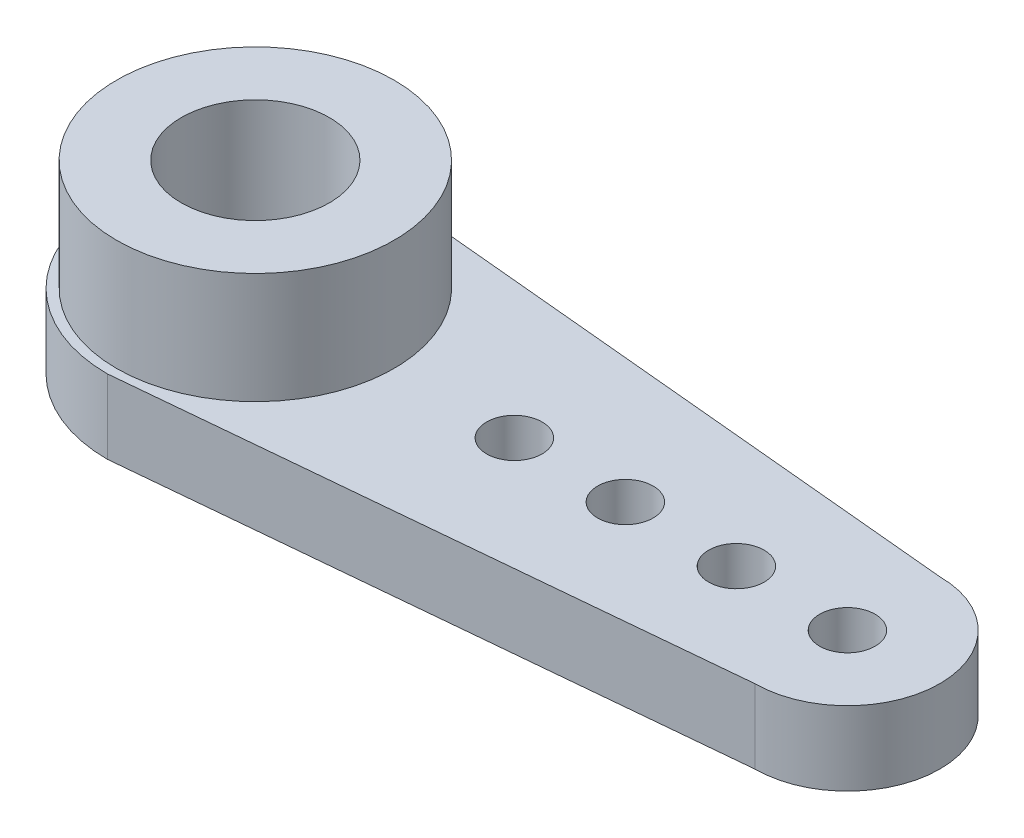
ISO-10303-21;
HEADER;
FILE_DESCRIPTION(('STEP AP214'),'2;1');
FILE_NAME('part.step','',(''),(''),'','','');
FILE_SCHEMA(('AUTOMOTIVE_DESIGN { 1 0 10303 214 1 1 1 1 }'));
ENDSEC;
DATA;
#1=APPLICATION_CONTEXT('core data for automotive mechanical design processes');
#2=APPLICATION_PROTOCOL_DEFINITION('international standard','automotive_design',2000,#1);
#3=PRODUCT_CONTEXT('',#1,'mechanical');
#4=PRODUCT('Part','Part','',(#3));
#5=PRODUCT_RELATED_PRODUCT_CATEGORY('part','',(#4));
#6=PRODUCT_DEFINITION_FORMATION('','',#4);
#7=PRODUCT_DEFINITION_CONTEXT('part definition',#1,'design');
#8=PRODUCT_DEFINITION('design','',#6,#7);
#9=PRODUCT_DEFINITION_SHAPE('','',#8);
#10=(LENGTH_UNIT() NAMED_UNIT(*) SI_UNIT(.MILLI.,.METRE.));
#11=(NAMED_UNIT(*) PLANE_ANGLE_UNIT() SI_UNIT($,.RADIAN.));
#12=(NAMED_UNIT(*) SI_UNIT($,.STERADIAN.) SOLID_ANGLE_UNIT());
#13=UNCERTAINTY_MEASURE_WITH_UNIT(LENGTH_MEASURE(1.E-05),#10,'distance_accuracy_value','');
#14=(GEOMETRIC_REPRESENTATION_CONTEXT(3) GLOBAL_UNCERTAINTY_ASSIGNED_CONTEXT((#13)) GLOBAL_UNIT_ASSIGNED_CONTEXT((#10,
#11,#12)) REPRESENTATION_CONTEXT('',''));
#15=CARTESIAN_POINT('',(0.,0.,0.));
#16=DIRECTION('',(0.,0.,1.));
#17=DIRECTION('',(1.,0.,0.));
#18=AXIS2_PLACEMENT_3D('',#15,#16,#17);
#19=CARTESIAN_POINT('',(0.,2.,0.));
#20=DIRECTION('',(0.,1.,0.));
#21=DIRECTION('',(0.,0.,1.));
#22=AXIS2_PLACEMENT_3D('',#19,#20,#21);
#23=PLANE('',#22);
#24=CARTESIAN_POINT('',(7.,2.,0.));
#25=DIRECTION('',(0.,1.,0.));
#26=DIRECTION('',(0.,0.,1.));
#27=AXIS2_PLACEMENT_3D('',#24,#25,#26);
#28=CIRCLE('',#27,0.749999999999999);
#29=CARTESIAN_POINT('',(7.,2.,0.749999999999999));
#30=VERTEX_POINT('',#29);
#31=EDGE_CURVE('E140',#30,#30,#28,.T.);
#32=ORIENTED_EDGE('',*,*,#31,.F.);
#33=EDGE_LOOP('',(#32));
#34=FACE_BOUND('',#33,.T.);
#35=CARTESIAN_POINT('',(13.,2.,0.));
#36=DIRECTION('',(0.,1.,0.));
#37=DIRECTION('',(0.,0.,1.));
#38=AXIS2_PLACEMENT_3D('',#35,#36,#37);
#39=CIRCLE('',#38,0.75);
#40=CARTESIAN_POINT('',(13.,2.,0.75));
#41=VERTEX_POINT('',#40);
#42=EDGE_CURVE('E150',#41,#41,#39,.T.);
#43=ORIENTED_EDGE('',*,*,#42,.F.);
#44=EDGE_LOOP('',(#43));
#45=FACE_BOUND('',#44,.T.);
#46=CARTESIAN_POINT('',(0.,2.,0.));
#47=DIRECTION('',(0.,1.,0.));
#48=DIRECTION('',(0.,0.,1.));
#49=AXIS2_PLACEMENT_3D('',#46,#47,#48);
#50=CIRCLE('',#49,4.);
#51=CARTESIAN_POINT('',(0.,2.,-4.));
#52=VERTEX_POINT('',#51);
#53=CARTESIAN_POINT('',(0.,2.,4.));
#54=VERTEX_POINT('',#53);
#55=EDGE_CURVE('E86',#52,#54,#50,.T.);
#56=ORIENTED_EDGE('',*,*,#55,.T.);
#57=DIRECTION('',(0.995634226059288,0.,-0.0933407086930583));
#58=VECTOR('',#57,1.);
#59=CARTESIAN_POINT('',(0.,2.,4.));
#60=LINE('',#59,#58);
#61=CARTESIAN_POINT('',(16.,2.,2.5));
#62=VERTEX_POINT('',#61);
#63=EDGE_CURVE('E81',#54,#62,#60,.T.);
#64=ORIENTED_EDGE('',*,*,#63,.T.);
#65=CARTESIAN_POINT('',(16.,2.,0.));
#66=DIRECTION('',(0.,1.,0.));
#67=DIRECTION('',(0.,0.,1.));
#68=AXIS2_PLACEMENT_3D('',#65,#66,#67);
#69=CIRCLE('',#68,2.5);
#70=CARTESIAN_POINT('',(16.,2.,-2.5));
#71=VERTEX_POINT('',#70);
#72=EDGE_CURVE('E84',#62,#71,#69,.T.);
#73=ORIENTED_EDGE('',*,*,#72,.T.);
#74=DIRECTION('',(-0.995634226059288,0.,-0.0933407086930583));
#75=VECTOR('',#74,1.);
#76=CARTESIAN_POINT('',(0.,2.,-4.));
#77=LINE('',#76,#75);
#78=EDGE_CURVE('E50',#71,#52,#77,.T.);
#79=ORIENTED_EDGE('',*,*,#78,.T.);
#80=EDGE_LOOP('',(#56,#64,#73,#79));
#81=FACE_BOUND('',#80,.T.);
#82=CARTESIAN_POINT('',(16.,2.,0.));
#83=DIRECTION('',(0.,1.,0.));
#84=DIRECTION('',(0.,0.,1.));
#85=AXIS2_PLACEMENT_3D('',#82,#83,#84);
#86=CIRCLE('',#85,0.750000000000002);
#87=CARTESIAN_POINT('',(16.,2.,0.750000000000002));
#88=VERTEX_POINT('',#87);
#89=EDGE_CURVE('E103',#88,#88,#86,.T.);
#90=ORIENTED_EDGE('',*,*,#89,.F.);
#91=EDGE_LOOP('',(#90));
#92=FACE_BOUND('',#91,.T.);
#93=CARTESIAN_POINT('',(10.,2.,0.));
#94=DIRECTION('',(0.,1.,0.));
#95=DIRECTION('',(0.,0.,1.));
#96=AXIS2_PLACEMENT_3D('',#93,#94,#95);
#97=CIRCLE('',#96,0.75);
#98=CARTESIAN_POINT('',(10.,2.,0.75));
#99=VERTEX_POINT('',#98);
#100=EDGE_CURVE('E145',#99,#99,#97,.T.);
#101=ORIENTED_EDGE('',*,*,#100,.F.);
#102=EDGE_LOOP('',(#101));
#103=FACE_BOUND('',#102,.T.);
#104=CARTESIAN_POINT('',(0.,2.,0.));
#105=DIRECTION('',(0.,1.,0.));
#106=DIRECTION('',(0.,0.,1.));
#107=AXIS2_PLACEMENT_3D('',#104,#105,#106);
#108=CIRCLE('',#107,3.75);
#109=CARTESIAN_POINT('',(0.,2.,3.75));
#110=VERTEX_POINT('',#109);
#111=EDGE_CURVE('E136',#110,#110,#108,.T.);
#112=ORIENTED_EDGE('',*,*,#111,.F.);
#113=EDGE_LOOP('',(#112));
#114=FACE_BOUND('',#113,.T.);
#115=ADVANCED_FACE('F33',(#34,#45,#81,#92,#103,#114),#23,.T.);
#116=CARTESIAN_POINT('',(0.,2.,0.));
#117=DIRECTION('',(0.,1.,0.));
#118=DIRECTION('',(0.,0.,1.));
#119=AXIS2_PLACEMENT_3D('',#116,#117,#118);
#120=CIRCLE('',#119,2.);
#121=CARTESIAN_POINT('',(0.,2.,2.));
#122=VERTEX_POINT('',#121);
#123=EDGE_CURVE('E11',#122,#122,#120,.F.);
#124=ORIENTED_EDGE('',*,*,#123,.F.);
#125=EDGE_LOOP('',(#124));
#126=FACE_BOUND('',#125,.T.);
#127=CARTESIAN_POINT('',(0.,2.,0.));
#128=DIRECTION('',(0.,1.,0.));
#129=DIRECTION('',(0.,0.,1.));
#130=AXIS2_PLACEMENT_3D('',#127,#128,#129);
#131=CIRCLE('',#130,1.);
#132=CARTESIAN_POINT('',(0.,2.,1.));
#133=VERTEX_POINT('',#132);
#134=EDGE_CURVE('E129',#133,#133,#131,.T.);
#135=ORIENTED_EDGE('',*,*,#134,.F.);
#136=EDGE_LOOP('',(#135));
#137=FACE_BOUND('',#136,.T.);
#138=ADVANCED_FACE('F114',(#126,#137),#23,.T.);
#139=CARTESIAN_POINT('',(0.,0.,0.));
#140=DIRECTION('',(0.,1.,0.));
#141=DIRECTION('',(0.,0.,1.));
#142=AXIS2_PLACEMENT_3D('',#139,#140,#141);
#143=PLANE('',#142);
#144=CARTESIAN_POINT('',(7.,0.,0.));
#145=DIRECTION('',(0.,1.,0.));
#146=DIRECTION('',(0.,0.,1.));
#147=AXIS2_PLACEMENT_3D('',#144,#145,#146);
#148=CIRCLE('',#147,0.749999999999999);
#149=CARTESIAN_POINT('',(7.,0.,0.749999999999999));
#150=VERTEX_POINT('',#149);
#151=EDGE_CURVE('E133',#150,#150,#148,.T.);
#152=ORIENTED_EDGE('',*,*,#151,.T.);
#153=EDGE_LOOP('',(#152));
#154=FACE_BOUND('',#153,.T.);
#155=CARTESIAN_POINT('',(13.,0.,0.));
#156=DIRECTION('',(0.,1.,0.));
#157=DIRECTION('',(0.,0.,1.));
#158=AXIS2_PLACEMENT_3D('',#155,#156,#157);
#159=CIRCLE('',#158,0.75);
#160=CARTESIAN_POINT('',(13.,0.,0.75));
#161=VERTEX_POINT('',#160);
#162=EDGE_CURVE('E148',#161,#161,#159,.T.);
#163=ORIENTED_EDGE('',*,*,#162,.T.);
#164=EDGE_LOOP('',(#163));
#165=FACE_BOUND('',#164,.T.);
#166=CARTESIAN_POINT('',(0.,0.,0.));
#167=DIRECTION('',(0.,1.,0.));
#168=DIRECTION('',(0.,0.,1.));
#169=AXIS2_PLACEMENT_3D('',#166,#167,#168);
#170=CIRCLE('',#169,4.);
#171=CARTESIAN_POINT('',(0.,0.,-4.));
#172=VERTEX_POINT('',#171);
#173=CARTESIAN_POINT('',(0.,0.,4.));
#174=VERTEX_POINT('',#173);
#175=EDGE_CURVE('E100',#172,#174,#170,.T.);
#176=ORIENTED_EDGE('',*,*,#175,.F.);
#177=DIRECTION('',(-0.995634226059288,0.,-0.0933407086930583));
#178=VECTOR('',#177,1.);
#179=CARTESIAN_POINT('',(0.,0.,-4.));
#180=LINE('',#179,#178);
#181=CARTESIAN_POINT('',(16.,0.,-2.5));
#182=VERTEX_POINT('',#181);
#183=EDGE_CURVE('E73',#182,#172,#180,.T.);
#184=ORIENTED_EDGE('',*,*,#183,.F.);
#185=CARTESIAN_POINT('',(16.,0.,0.));
#186=DIRECTION('',(0.,1.,0.));
#187=DIRECTION('',(0.,0.,1.));
#188=AXIS2_PLACEMENT_3D('',#185,#186,#187);
#189=CIRCLE('',#188,2.5);
#190=CARTESIAN_POINT('',(16.,0.,2.5));
#191=VERTEX_POINT('',#190);
#192=EDGE_CURVE('E67',#191,#182,#189,.T.);
#193=ORIENTED_EDGE('',*,*,#192,.F.);
#194=DIRECTION('',(0.995634226059288,0.,-0.0933407086930583));
#195=VECTOR('',#194,1.);
#196=CARTESIAN_POINT('',(0.,0.,4.));
#197=LINE('',#196,#195);
#198=EDGE_CURVE('E91',#174,#191,#197,.T.);
#199=ORIENTED_EDGE('',*,*,#198,.F.);
#200=EDGE_LOOP('',(#176,#184,#193,#199));
#201=FACE_BOUND('',#200,.T.);
#202=CARTESIAN_POINT('',(16.,0.,0.));
#203=DIRECTION('',(0.,1.,0.));
#204=DIRECTION('',(0.,0.,1.));
#205=AXIS2_PLACEMENT_3D('',#202,#203,#204);
#206=CIRCLE('',#205,0.750000000000002);
#207=CARTESIAN_POINT('',(16.,0.,0.750000000000002));
#208=VERTEX_POINT('',#207);
#209=EDGE_CURVE('E120',#208,#208,#206,.T.);
#210=ORIENTED_EDGE('',*,*,#209,.T.);
#211=EDGE_LOOP('',(#210));
#212=FACE_BOUND('',#211,.T.);
#213=CARTESIAN_POINT('',(10.,0.,0.));
#214=DIRECTION('',(0.,1.,0.));
#215=DIRECTION('',(0.,0.,1.));
#216=AXIS2_PLACEMENT_3D('',#213,#214,#215);
#217=CIRCLE('',#216,0.75);
#218=CARTESIAN_POINT('',(10.,0.,0.75));
#219=VERTEX_POINT('',#218);
#220=EDGE_CURVE('E124',#219,#219,#217,.T.);
#221=ORIENTED_EDGE('',*,*,#220,.T.);
#222=EDGE_LOOP('',(#221));
#223=FACE_BOUND('',#222,.T.);
#224=CARTESIAN_POINT('',(0.,0.,0.));
#225=DIRECTION('',(0.,1.,0.));
#226=DIRECTION('',(0.,0.,1.));
#227=AXIS2_PLACEMENT_3D('',#224,#225,#226);
#228=CIRCLE('',#227,1.);
#229=CARTESIAN_POINT('',(0.,0.,1.));
#230=VERTEX_POINT('',#229);
#231=EDGE_CURVE('E127',#230,#230,#228,.T.);
#232=ORIENTED_EDGE('',*,*,#231,.T.);
#233=EDGE_LOOP('',(#232));
#234=FACE_BOUND('',#233,.T.);
#235=ADVANCED_FACE('F111',(#154,#165,#201,#212,#223,#234),#143,.F.);
#236=CARTESIAN_POINT('',(0.,2.,0.));
#237=DIRECTION('',(0.,-1.,0.));
#238=DIRECTION('',(0.,0.,-1.));
#239=AXIS2_PLACEMENT_3D('',#236,#237,#238);
#240=CYLINDRICAL_SURFACE('',#239,4.);
#241=ORIENTED_EDGE('',*,*,#175,.T.);
#242=DIRECTION('',(0.,-1.,0.));
#243=VECTOR('',#242,1.);
#244=CARTESIAN_POINT('',(0.,2.,4.));
#245=LINE('',#244,#243);
#246=EDGE_CURVE('E42',#54,#174,#245,.T.);
#247=ORIENTED_EDGE('',*,*,#246,.F.);
#248=ORIENTED_EDGE('',*,*,#55,.F.);
#249=DIRECTION('',(0.,-1.,0.));
#250=VECTOR('',#249,1.);
#251=CARTESIAN_POINT('',(0.,2.,-4.));
#252=LINE('',#251,#250);
#253=EDGE_CURVE('E96',#52,#172,#252,.T.);
#254=ORIENTED_EDGE('',*,*,#253,.T.);
#255=EDGE_LOOP('',(#241,#247,#248,#254));
#256=FACE_BOUND('',#255,.T.);
#257=ADVANCED_FACE('F35',(#256),#240,.T.);
#258=CARTESIAN_POINT('',(0.,2.,4.));
#259=DIRECTION('',(-0.0933407086930583,0.,-0.995634226059288));
#260=DIRECTION('',(-0.995634226059288,0.,0.0933407086930583));
#261=AXIS2_PLACEMENT_3D('',#258,#259,#260);
#262=PLANE('',#261);
#263=ORIENTED_EDGE('',*,*,#198,.T.);
#264=DIRECTION('',(0.,-1.,0.));
#265=VECTOR('',#264,1.);
#266=CARTESIAN_POINT('',(16.,2.,2.5));
#267=LINE('',#266,#265);
#268=EDGE_CURVE('E89',#62,#191,#267,.T.);
#269=ORIENTED_EDGE('',*,*,#268,.F.);
#270=ORIENTED_EDGE('',*,*,#63,.F.);
#271=ORIENTED_EDGE('',*,*,#246,.T.);
#272=EDGE_LOOP('',(#263,#269,#270,#271));
#273=FACE_BOUND('',#272,.T.);
#274=ADVANCED_FACE('F90',(#273),#262,.F.);
#275=CARTESIAN_POINT('',(16.,2.,0.));
#276=DIRECTION('',(0.,-1.,0.));
#277=DIRECTION('',(0.,0.,-1.));
#278=AXIS2_PLACEMENT_3D('',#275,#276,#277);
#279=CYLINDRICAL_SURFACE('',#278,2.5);
#280=ORIENTED_EDGE('',*,*,#192,.T.);
#281=DIRECTION('',(0.,-1.,0.));
#282=VECTOR('',#281,1.);
#283=CARTESIAN_POINT('',(16.,2.,-2.5));
#284=LINE('',#283,#282);
#285=EDGE_CURVE('E92',#71,#182,#284,.T.);
#286=ORIENTED_EDGE('',*,*,#285,.F.);
#287=ORIENTED_EDGE('',*,*,#72,.F.);
#288=ORIENTED_EDGE('',*,*,#268,.T.);
#289=EDGE_LOOP('',(#280,#286,#287,#288));
#290=FACE_BOUND('',#289,.T.);
#291=ADVANCED_FACE('F94',(#290),#279,.T.);
#292=CARTESIAN_POINT('',(0.,2.,-4.));
#293=DIRECTION('',(-0.0933407086930583,0.,0.995634226059288));
#294=DIRECTION('',(0.995634226059288,0.,0.0933407086930583));
#295=AXIS2_PLACEMENT_3D('',#292,#293,#294);
#296=PLANE('',#295);
#297=ORIENTED_EDGE('',*,*,#183,.T.);
#298=ORIENTED_EDGE('',*,*,#253,.F.);
#299=ORIENTED_EDGE('',*,*,#78,.F.);
#300=ORIENTED_EDGE('',*,*,#285,.T.);
#301=EDGE_LOOP('',(#297,#298,#299,#300));
#302=FACE_BOUND('',#301,.T.);
#303=ADVANCED_FACE('F207',(#302),#296,.F.);
#304=CARTESIAN_POINT('',(16.,2.,0.));
#305=DIRECTION('',(0.,-1.,0.));
#306=DIRECTION('',(0.,0.,-1.));
#307=AXIS2_PLACEMENT_3D('',#304,#305,#306);
#308=CYLINDRICAL_SURFACE('',#307,0.750000000000002);
#309=ORIENTED_EDGE('',*,*,#89,.T.);
#310=EDGE_LOOP('',(#309));
#311=FACE_BOUND('',#310,.T.);
#312=ORIENTED_EDGE('',*,*,#209,.F.);
#313=EDGE_LOOP('',(#312));
#314=FACE_BOUND('',#313,.T.);
#315=ADVANCED_FACE('F159',(#311,#314),#308,.F.);
#316=CARTESIAN_POINT('',(13.,2.,0.));
#317=DIRECTION('',(0.,-1.,0.));
#318=DIRECTION('',(0.,0.,-1.));
#319=AXIS2_PLACEMENT_3D('',#316,#317,#318);
#320=CYLINDRICAL_SURFACE('',#319,0.75);
#321=ORIENTED_EDGE('',*,*,#42,.T.);
#322=EDGE_LOOP('',(#321));
#323=FACE_BOUND('',#322,.T.);
#324=ORIENTED_EDGE('',*,*,#162,.F.);
#325=EDGE_LOOP('',(#324));
#326=FACE_BOUND('',#325,.T.);
#327=ADVANCED_FACE('F201',(#323,#326),#320,.F.);
#328=CARTESIAN_POINT('',(10.,2.,0.));
#329=DIRECTION('',(0.,-1.,0.));
#330=DIRECTION('',(0.,0.,-1.));
#331=AXIS2_PLACEMENT_3D('',#328,#329,#330);
#332=CYLINDRICAL_SURFACE('',#331,0.75);
#333=ORIENTED_EDGE('',*,*,#100,.T.);
#334=EDGE_LOOP('',(#333));
#335=FACE_BOUND('',#334,.T.);
#336=ORIENTED_EDGE('',*,*,#220,.F.);
#337=EDGE_LOOP('',(#336));
#338=FACE_BOUND('',#337,.T.);
#339=ADVANCED_FACE('F197',(#335,#338),#332,.F.);
#340=CARTESIAN_POINT('',(7.,2.,0.));
#341=DIRECTION('',(0.,-1.,0.));
#342=DIRECTION('',(0.,0.,-1.));
#343=AXIS2_PLACEMENT_3D('',#340,#341,#342);
#344=CYLINDRICAL_SURFACE('',#343,0.749999999999999);
#345=ORIENTED_EDGE('',*,*,#31,.T.);
#346=EDGE_LOOP('',(#345));
#347=FACE_BOUND('',#346,.T.);
#348=ORIENTED_EDGE('',*,*,#151,.F.);
#349=EDGE_LOOP('',(#348));
#350=FACE_BOUND('',#349,.T.);
#351=ADVANCED_FACE('F190',(#347,#350),#344,.F.);
#352=CARTESIAN_POINT('',(0.,2.,0.));
#353=DIRECTION('',(0.,-1.,0.));
#354=DIRECTION('',(0.,0.,-1.));
#355=AXIS2_PLACEMENT_3D('',#352,#353,#354);
#356=CYLINDRICAL_SURFACE('',#355,1.);
#357=ORIENTED_EDGE('',*,*,#134,.T.);
#358=EDGE_LOOP('',(#357));
#359=FACE_BOUND('',#358,.T.);
#360=ORIENTED_EDGE('',*,*,#231,.F.);
#361=EDGE_LOOP('',(#360));
#362=FACE_BOUND('',#361,.T.);
#363=ADVANCED_FACE('F181',(#359,#362),#356,.F.);
#364=CARTESIAN_POINT('',(0.,5.,0.));
#365=DIRECTION('',(0.,1.,0.));
#366=DIRECTION('',(0.,0.,1.));
#367=AXIS2_PLACEMENT_3D('',#364,#365,#366);
#368=PLANE('',#367);
#369=CARTESIAN_POINT('',(0.,5.,0.));
#370=DIRECTION('',(0.,1.,0.));
#371=DIRECTION('',(0.,0.,1.));
#372=AXIS2_PLACEMENT_3D('',#369,#370,#371);
#373=CIRCLE('',#372,3.75);
#374=CARTESIAN_POINT('',(0.,5.,3.75));
#375=VERTEX_POINT('',#374);
#376=EDGE_CURVE('E130',#375,#375,#373,.T.);
#377=ORIENTED_EDGE('',*,*,#376,.T.);
#378=EDGE_LOOP('',(#377));
#379=FACE_BOUND('',#378,.T.);
#380=CARTESIAN_POINT('',(0.,5.,0.));
#381=DIRECTION('',(0.,1.,0.));
#382=DIRECTION('',(0.,0.,1.));
#383=AXIS2_PLACEMENT_3D('',#380,#381,#382);
#384=CIRCLE('',#383,2.);
#385=CARTESIAN_POINT('',(0.,5.,2.));
#386=VERTEX_POINT('',#385);
#387=EDGE_CURVE('E170',#386,#386,#384,.T.);
#388=ORIENTED_EDGE('',*,*,#387,.F.);
#389=EDGE_LOOP('',(#388));
#390=FACE_BOUND('',#389,.T.);
#391=ADVANCED_FACE('F178',(#379,#390),#368,.T.);
#392=CARTESIAN_POINT('',(0.,5.,0.));
#393=DIRECTION('',(0.,-1.,0.));
#394=DIRECTION('',(0.,0.,-1.));
#395=AXIS2_PLACEMENT_3D('',#392,#393,#394);
#396=CYLINDRICAL_SURFACE('',#395,3.75);
#397=ORIENTED_EDGE('',*,*,#376,.F.);
#398=EDGE_LOOP('',(#397));
#399=FACE_BOUND('',#398,.T.);
#400=ORIENTED_EDGE('',*,*,#111,.T.);
#401=EDGE_LOOP('',(#400));
#402=FACE_BOUND('',#401,.T.);
#403=ADVANCED_FACE('F180',(#399,#402),#396,.T.);
#404=CARTESIAN_POINT('',(0.,5.,0.));
#405=DIRECTION('',(0.,-1.,0.));
#406=DIRECTION('',(0.,0.,-1.));
#407=AXIS2_PLACEMENT_3D('',#404,#405,#406);
#408=CYLINDRICAL_SURFACE('',#407,2.);
#409=ORIENTED_EDGE('',*,*,#387,.T.);
#410=EDGE_LOOP('',(#409));
#411=FACE_BOUND('',#410,.T.);
#412=ORIENTED_EDGE('',*,*,#123,.T.);
#413=EDGE_LOOP('',(#412));
#414=FACE_BOUND('',#413,.T.);
#415=ADVANCED_FACE('F175',(#411,#414),#408,.F.);
#416=CLOSED_SHELL('',(#115,#138,#235,#257,#274,#291,#303,#315,#327,#339,#351,#363,#391,#403,#415));
#417=MANIFOLD_SOLID_BREP('B2',#416);
#418=ADVANCED_BREP_SHAPE_REPRESENTATION('',(#18,#417),#14);
#419=SHAPE_DEFINITION_REPRESENTATION(#9,#418);
ENDSEC;
END-ISO-10303-21;
